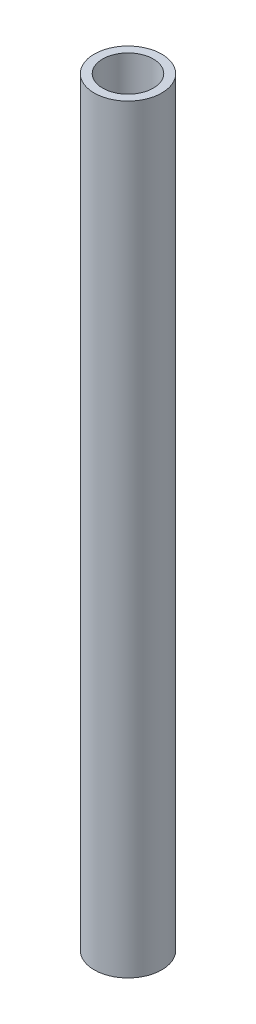
ISO-10303-21;
HEADER;
FILE_DESCRIPTION(('STEP AP214'),'2;1');
FILE_NAME('part.step','',(''),(''),'','','');
FILE_SCHEMA(('AUTOMOTIVE_DESIGN { 1 0 10303 214 1 1 1 1 }'));
ENDSEC;
DATA;
#1=APPLICATION_CONTEXT('core data for automotive mechanical design processes');
#2=APPLICATION_PROTOCOL_DEFINITION('international standard','automotive_design',2000,#1);
#3=PRODUCT_CONTEXT('',#1,'mechanical');
#4=PRODUCT('Part','Part','',(#3));
#5=PRODUCT_RELATED_PRODUCT_CATEGORY('part','',(#4));
#6=PRODUCT_DEFINITION_FORMATION('','',#4);
#7=PRODUCT_DEFINITION_CONTEXT('part definition',#1,'design');
#8=PRODUCT_DEFINITION('design','',#6,#7);
#9=PRODUCT_DEFINITION_SHAPE('','',#8);
#10=(LENGTH_UNIT() NAMED_UNIT(*) SI_UNIT(.MILLI.,.METRE.));
#11=(NAMED_UNIT(*) PLANE_ANGLE_UNIT() SI_UNIT($,.RADIAN.));
#12=(NAMED_UNIT(*) SI_UNIT($,.STERADIAN.) SOLID_ANGLE_UNIT());
#13=UNCERTAINTY_MEASURE_WITH_UNIT(LENGTH_MEASURE(1.E-05),#10,'distance_accuracy_value','');
#14=(GEOMETRIC_REPRESENTATION_CONTEXT(3) GLOBAL_UNCERTAINTY_ASSIGNED_CONTEXT((#13)) GLOBAL_UNIT_ASSIGNED_CONTEXT((#10,
#11,#12)) REPRESENTATION_CONTEXT('',''));
#15=CARTESIAN_POINT('',(0.,0.,0.));
#16=DIRECTION('',(0.,0.,1.));
#17=DIRECTION('',(1.,0.,0.));
#18=AXIS2_PLACEMENT_3D('',#15,#16,#17);
#19=CARTESIAN_POINT('',(0.,0.,0.));
#20=DIRECTION('',(0.,1.,0.));
#21=DIRECTION('',(0.,0.,1.));
#22=AXIS2_PLACEMENT_3D('',#19,#20,#21);
#23=PLANE('',#22);
#24=CARTESIAN_POINT('',(0.,0.,0.));
#25=DIRECTION('',(0.,1.,0.));
#26=DIRECTION('',(0.,0.,1.));
#27=AXIS2_PLACEMENT_3D('',#24,#25,#26);
#28=CIRCLE('',#27,2.);
#29=CARTESIAN_POINT('',(0.,0.,2.));
#30=VERTEX_POINT('',#29);
#31=EDGE_CURVE('E10',#30,#30,#28,.T.);
#32=ORIENTED_EDGE('',*,*,#31,.F.);
#33=EDGE_LOOP('',(#32));
#34=FACE_BOUND('',#33,.T.);
#35=CARTESIAN_POINT('',(0.,0.,0.));
#36=DIRECTION('',(0.,1.,0.));
#37=DIRECTION('',(0.,0.,1.));
#38=AXIS2_PLACEMENT_3D('',#35,#36,#37);
#39=CIRCLE('',#38,1.5);
#40=CARTESIAN_POINT('',(0.,0.,1.5));
#41=VERTEX_POINT('',#40);
#42=EDGE_CURVE('E41',#41,#41,#39,.T.);
#43=ORIENTED_EDGE('',*,*,#42,.T.);
#44=EDGE_LOOP('',(#43));
#45=FACE_BOUND('',#44,.T.);
#46=ADVANCED_FACE('F34',(#34,#45),#23,.F.);
#47=CARTESIAN_POINT('',(0.,40.,0.));
#48=DIRECTION('',(0.,-1.,0.));
#49=DIRECTION('',(0.,0.,-1.));
#50=AXIS2_PLACEMENT_3D('',#47,#48,#49);
#51=CYLINDRICAL_SURFACE('',#50,2.);
#52=ORIENTED_EDGE('',*,*,#31,.T.);
#53=EDGE_LOOP('',(#52));
#54=FACE_BOUND('',#53,.T.);
#55=CARTESIAN_POINT('',(0.,45.,0.));
#56=DIRECTION('',(0.,1.,0.));
#57=DIRECTION('',(0.,0.,1.));
#58=AXIS2_PLACEMENT_3D('',#55,#56,#57);
#59=CIRCLE('',#58,2.);
#60=CARTESIAN_POINT('',(0.,45.,2.));
#61=VERTEX_POINT('',#60);
#62=EDGE_CURVE('E45',#61,#61,#59,.T.);
#63=ORIENTED_EDGE('',*,*,#62,.F.);
#64=EDGE_LOOP('',(#63));
#65=FACE_BOUND('',#64,.T.);
#66=ADVANCED_FACE('F36',(#54,#65),#51,.T.);
#67=CARTESIAN_POINT('',(0.,40.,0.));
#68=DIRECTION('',(0.,-1.,0.));
#69=DIRECTION('',(0.,0.,-1.));
#70=AXIS2_PLACEMENT_3D('',#67,#68,#69);
#71=CYLINDRICAL_SURFACE('',#70,1.5);
#72=ORIENTED_EDGE('',*,*,#42,.F.);
#73=EDGE_LOOP('',(#72));
#74=FACE_BOUND('',#73,.T.);
#75=CARTESIAN_POINT('',(0.,45.,0.));
#76=DIRECTION('',(0.,1.,0.));
#77=DIRECTION('',(0.,0.,1.));
#78=AXIS2_PLACEMENT_3D('',#75,#76,#77);
#79=CIRCLE('',#78,1.5);
#80=CARTESIAN_POINT('',(0.,45.,1.5));
#81=VERTEX_POINT('',#80);
#82=EDGE_CURVE('E49',#81,#81,#79,.T.);
#83=ORIENTED_EDGE('',*,*,#82,.T.);
#84=EDGE_LOOP('',(#83));
#85=FACE_BOUND('',#84,.T.);
#86=ADVANCED_FACE('F55',(#74,#85),#71,.F.);
#87=CARTESIAN_POINT('',(0.,45.,0.));
#88=DIRECTION('',(0.,1.,0.));
#89=DIRECTION('',(0.,0.,1.));
#90=AXIS2_PLACEMENT_3D('',#87,#88,#89);
#91=PLANE('',#90);
#92=ORIENTED_EDGE('',*,*,#62,.T.);
#93=EDGE_LOOP('',(#92));
#94=FACE_BOUND('',#93,.T.);
#95=ORIENTED_EDGE('',*,*,#82,.F.);
#96=EDGE_LOOP('',(#95));
#97=FACE_BOUND('',#96,.T.);
#98=ADVANCED_FACE('F57',(#94,#97),#91,.T.);
#99=CLOSED_SHELL('',(#46,#66,#86,#98));
#100=MANIFOLD_SOLID_BREP('B2',#99);
#101=ADVANCED_BREP_SHAPE_REPRESENTATION('',(#18,#100),#14);
#102=SHAPE_DEFINITION_REPRESENTATION(#9,#101);
ENDSEC;
END-ISO-10303-21;
